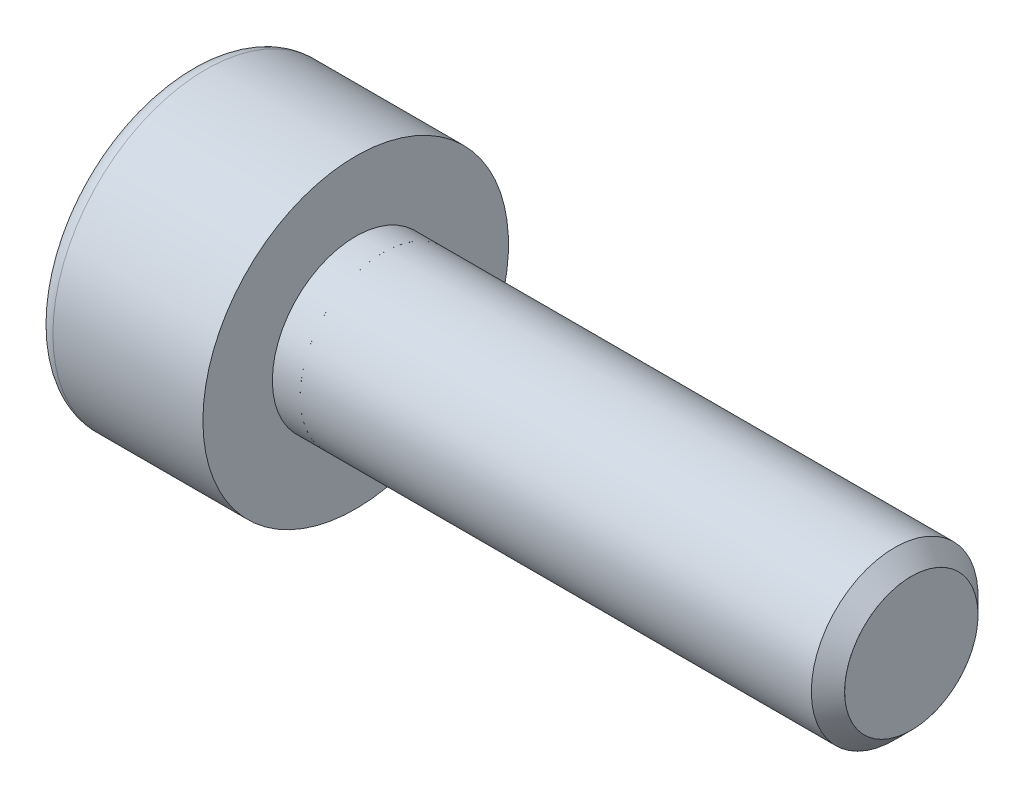
ISO-10303-21;
HEADER;
FILE_DESCRIPTION(('STEP AP214'),'2;1');
FILE_NAME('part.step','',(''),(''),'','','');
FILE_SCHEMA(('AUTOMOTIVE_DESIGN { 1 0 10303 214 1 1 1 1 }'));
ENDSEC;
DATA;
#1=APPLICATION_CONTEXT('core data for automotive mechanical design processes');
#2=APPLICATION_PROTOCOL_DEFINITION('international standard','automotive_design',2000,#1);
#3=PRODUCT_CONTEXT('',#1,'mechanical');
#4=PRODUCT('Part','Part','',(#3));
#5=PRODUCT_RELATED_PRODUCT_CATEGORY('part','',(#4));
#6=PRODUCT_DEFINITION_FORMATION('','',#4);
#7=PRODUCT_DEFINITION_CONTEXT('part definition',#1,'design');
#8=PRODUCT_DEFINITION('design','',#6,#7);
#9=PRODUCT_DEFINITION_SHAPE('','',#8);
#10=(LENGTH_UNIT() NAMED_UNIT(*) SI_UNIT(.MILLI.,.METRE.));
#11=(NAMED_UNIT(*) PLANE_ANGLE_UNIT() SI_UNIT($,.RADIAN.));
#12=(NAMED_UNIT(*) SI_UNIT($,.STERADIAN.) SOLID_ANGLE_UNIT());
#13=UNCERTAINTY_MEASURE_WITH_UNIT(LENGTH_MEASURE(1.E-05),#10,'distance_accuracy_value','');
#14=(GEOMETRIC_REPRESENTATION_CONTEXT(3) GLOBAL_UNCERTAINTY_ASSIGNED_CONTEXT((#13)) GLOBAL_UNIT_ASSIGNED_CONTEXT((#10,
#11,#12)) REPRESENTATION_CONTEXT('',''));
#15=CARTESIAN_POINT('',(0.,0.,0.));
#16=DIRECTION('',(0.,0.,1.));
#17=DIRECTION('',(1.,0.,0.));
#18=AXIS2_PLACEMENT_3D('',#15,#16,#17);
#19=CARTESIAN_POINT('',(1.5,0.,0.));
#20=DIRECTION('',(-1.,0.,0.));
#21=DIRECTION('',(0.,0.,1.));
#22=AXIS2_PLACEMENT_3D('',#19,#20,#21);
#23=PLANE('',#22);
#24=DIRECTION('',(0.,0.866025403784429,0.500000000000017));
#25=VECTOR('',#24,1.);
#26=CARTESIAN_POINT('',(1.5,1.25,-0.721687836487));
#27=LINE('',#26,#25);
#28=CARTESIAN_POINT('',(1.5,1.25,-0.721687836487001));
#29=VERTEX_POINT('',#28);
#30=CARTESIAN_POINT('',(1.5,0.,-1.44337567297402));
#31=VERTEX_POINT('',#30);
#32=EDGE_CURVE('P0_E129',#29,#31,#27,.F.);
#33=ORIENTED_EDGE('',*,*,#32,.T.);
#34=DIRECTION('',(0.,0.866025403784429,-0.500000000000017));
#35=VECTOR('',#34,1.);
#36=CARTESIAN_POINT('',(1.5,0.,-1.443375672974));
#37=LINE('',#36,#35);
#38=CARTESIAN_POINT('',(1.5,-1.24999999999999,-0.721687836486979));
#39=VERTEX_POINT('',#38);
#40=EDGE_CURVE('P0_E133',#31,#39,#37,.F.);
#41=ORIENTED_EDGE('',*,*,#40,.T.);
#42=DIRECTION('',(0.,0.,-1.));
#43=VECTOR('',#42,1.);
#44=CARTESIAN_POINT('',(1.5,-1.25,-0.721687836487));
#45=LINE('',#44,#43);
#46=CARTESIAN_POINT('',(1.5,-1.25,0.721687836487001));
#47=VERTEX_POINT('',#46);
#48=EDGE_CURVE('P0_E85',#39,#47,#45,.F.);
#49=ORIENTED_EDGE('',*,*,#48,.T.);
#50=DIRECTION('',(0.,-0.866025403784429,-0.500000000000017));
#51=VECTOR('',#50,1.);
#52=CARTESIAN_POINT('',(1.5,-1.25,0.721687836487));
#53=LINE('',#52,#51);
#54=CARTESIAN_POINT('',(1.5,0.,1.44337567297402));
#55=VERTEX_POINT('',#54);
#56=EDGE_CURVE('P0_E68',#47,#55,#53,.F.);
#57=ORIENTED_EDGE('',*,*,#56,.T.);
#58=DIRECTION('',(0.,-0.866025403784429,0.500000000000017));
#59=VECTOR('',#58,1.);
#60=CARTESIAN_POINT('',(1.5,0.,1.443375672974));
#61=LINE('',#60,#59);
#62=CARTESIAN_POINT('',(1.5,1.24999999999998,0.72168783648697));
#63=VERTEX_POINT('',#62);
#64=EDGE_CURVE('P0_E73',#55,#63,#61,.F.);
#65=ORIENTED_EDGE('',*,*,#64,.T.);
#66=DIRECTION('',(0.,0.,1.));
#67=VECTOR('',#66,1.);
#68=CARTESIAN_POINT('',(1.5,1.25,0.721687836487));
#69=LINE('',#68,#67);
#70=EDGE_CURVE('P0_E125',#63,#29,#69,.F.);
#71=ORIENTED_EDGE('',*,*,#70,.T.);
#72=EDGE_LOOP('',(#33,#41,#49,#57,#65,#71));
#73=FACE_BOUND('',#72,.T.);
#74=ADVANCED_FACE('P0_F17',(#73),#23,.T.);
#75=CARTESIAN_POINT('',(1.5,0.,1.443375672974));
#76=DIRECTION('',(0.,0.500000000000017,0.866025403784429));
#77=DIRECTION('',(0.,-0.866025403784429,0.500000000000017));
#78=AXIS2_PLACEMENT_3D('',#75,#76,#77);
#79=PLANE('',#78);
#80=DIRECTION('',(1.,0.,0.));
#81=VECTOR('',#80,1.);
#82=CARTESIAN_POINT('',(1.5,0.,1.44337567297405));
#83=LINE('',#82,#81);
#84=CARTESIAN_POINT('',(0.,0.,1.44337567297402));
#85=VERTEX_POINT('',#84);
#86=EDGE_CURVE('P0_E75',#55,#85,#83,.F.);
#87=ORIENTED_EDGE('',*,*,#86,.T.);
#88=DIRECTION('',(0.,-0.866025403784441,0.499999999999996));
#89=VECTOR('',#88,1.);
#90=CARTESIAN_POINT('',(0.,1.24999999999999,0.721687836486988));
#91=LINE('',#90,#89);
#92=CARTESIAN_POINT('',(0.,1.24999999999999,0.721687836486969));
#93=VERTEX_POINT('',#92);
#94=EDGE_CURVE('P0_E123',#93,#85,#91,.T.);
#95=ORIENTED_EDGE('',*,*,#94,.F.);
#96=DIRECTION('',(1.,0.,0.));
#97=VECTOR('',#96,1.);
#98=CARTESIAN_POINT('',(1.5,1.25,0.721687836486988));
#99=LINE('',#98,#97);
#100=EDGE_CURVE('P0_E78',#93,#63,#99,.T.);
#101=ORIENTED_EDGE('',*,*,#100,.T.);
#102=ORIENTED_EDGE('',*,*,#64,.F.);
#103=EDGE_LOOP('',(#87,#95,#101,#102));
#104=FACE_BOUND('',#103,.T.);
#105=ADVANCED_FACE('P0_F74',(#104),#79,.F.);
#106=CARTESIAN_POINT('',(1.5,-1.25,0.721687836487));
#107=DIRECTION('',(0.,-0.500000000000017,0.866025403784429));
#108=DIRECTION('',(0.,-0.866025403784429,-0.500000000000017));
#109=AXIS2_PLACEMENT_3D('',#106,#107,#108);
#110=PLANE('',#109);
#111=DIRECTION('',(1.,0.,0.));
#112=VECTOR('',#111,1.);
#113=CARTESIAN_POINT('',(1.5,-1.25,0.721687836487));
#114=LINE('',#113,#112);
#115=CARTESIAN_POINT('',(0.,-1.25,0.721687836487));
#116=VERTEX_POINT('',#115);
#117=EDGE_CURVE('P0_E87',#47,#116,#114,.F.);
#118=ORIENTED_EDGE('',*,*,#117,.T.);
#119=DIRECTION('',(0.,-0.866025403784443,-0.499999999999992));
#120=VECTOR('',#119,1.);
#121=CARTESIAN_POINT('',(0.,0.,1.44337567297401));
#122=LINE('',#121,#120);
#123=EDGE_CURVE('P0_E91',#85,#116,#122,.T.);
#124=ORIENTED_EDGE('',*,*,#123,.F.);
#125=ORIENTED_EDGE('',*,*,#86,.F.);
#126=ORIENTED_EDGE('',*,*,#56,.F.);
#127=EDGE_LOOP('',(#118,#124,#125,#126));
#128=FACE_BOUND('',#127,.T.);
#129=ADVANCED_FACE('P0_F89',(#128),#110,.F.);
#130=CARTESIAN_POINT('',(1.5,-1.25,-0.721687836487));
#131=DIRECTION('',(0.,-1.,0.));
#132=DIRECTION('',(0.,0.,-1.));
#133=AXIS2_PLACEMENT_3D('',#130,#131,#132);
#134=PLANE('',#133);
#135=DIRECTION('',(1.,0.,0.));
#136=VECTOR('',#135,1.);
#137=CARTESIAN_POINT('',(1.5,-1.24999999999997,-0.721687836486952));
#138=LINE('',#137,#136);
#139=CARTESIAN_POINT('',(0.,-1.24999999999999,-0.721687836486978));
#140=VERTEX_POINT('',#139);
#141=EDGE_CURVE('P0_E135',#39,#140,#138,.F.);
#142=ORIENTED_EDGE('',*,*,#141,.T.);
#143=DIRECTION('',(0.,0.,1.));
#144=VECTOR('',#143,1.);
#145=CARTESIAN_POINT('',(0.,-1.25,0.));
#146=LINE('',#145,#144);
#147=EDGE_CURVE('P0_E119',#116,#140,#146,.F.);
#148=ORIENTED_EDGE('',*,*,#147,.F.);
#149=ORIENTED_EDGE('',*,*,#117,.F.);
#150=ORIENTED_EDGE('',*,*,#48,.F.);
#151=EDGE_LOOP('',(#142,#148,#149,#150));
#152=FACE_BOUND('',#151,.T.);
#153=ADVANCED_FACE('P0_F139',(#152),#134,.F.);
#154=CARTESIAN_POINT('',(1.5,0.,-1.443375672974));
#155=DIRECTION('',(0.,-0.500000000000017,-0.866025403784429));
#156=DIRECTION('',(0.,0.866025403784429,-0.500000000000017));
#157=AXIS2_PLACEMENT_3D('',#154,#155,#156);
#158=PLANE('',#157);
#159=DIRECTION('',(1.,0.,0.));
#160=VECTOR('',#159,1.);
#161=CARTESIAN_POINT('',(1.5,0.,-1.44337567297405));
#162=LINE('',#161,#160);
#163=CARTESIAN_POINT('',(0.,0.,-1.44337567297402));
#164=VERTEX_POINT('',#163);
#165=EDGE_CURVE('P0_E131',#31,#164,#162,.F.);
#166=ORIENTED_EDGE('',*,*,#165,.T.);
#167=DIRECTION('',(0.,0.866025403784441,-0.499999999999996));
#168=VECTOR('',#167,1.);
#169=CARTESIAN_POINT('',(0.,-1.24999999999999,-0.721687836486988));
#170=LINE('',#169,#168);
#171=EDGE_CURVE('P0_E116',#140,#164,#170,.T.);
#172=ORIENTED_EDGE('',*,*,#171,.F.);
#173=ORIENTED_EDGE('',*,*,#141,.F.);
#174=ORIENTED_EDGE('',*,*,#40,.F.);
#175=EDGE_LOOP('',(#166,#172,#173,#174));
#176=FACE_BOUND('',#175,.T.);
#177=ADVANCED_FACE('P0_F149',(#176),#158,.F.);
#178=CARTESIAN_POINT('',(1.5,1.25,-0.721687836487));
#179=DIRECTION('',(0.,0.500000000000017,-0.866025403784429));
#180=DIRECTION('',(0.,0.866025403784429,0.500000000000017));
#181=AXIS2_PLACEMENT_3D('',#178,#179,#180);
#182=PLANE('',#181);
#183=DIRECTION('',(1.,0.,0.));
#184=VECTOR('',#183,1.);
#185=CARTESIAN_POINT('',(1.5,1.25,-0.721687836487));
#186=LINE('',#185,#184);
#187=CARTESIAN_POINT('',(0.,1.25,-0.721687836487));
#188=VERTEX_POINT('',#187);
#189=EDGE_CURVE('P0_E36',#29,#188,#186,.F.);
#190=ORIENTED_EDGE('',*,*,#189,.T.);
#191=DIRECTION('',(0.,0.866025403784443,0.499999999999992));
#192=VECTOR('',#191,1.);
#193=CARTESIAN_POINT('',(0.,0.,-1.44337567297401));
#194=LINE('',#193,#192);
#195=EDGE_CURVE('P0_E113',#164,#188,#194,.T.);
#196=ORIENTED_EDGE('',*,*,#195,.F.);
#197=ORIENTED_EDGE('',*,*,#165,.F.);
#198=ORIENTED_EDGE('',*,*,#32,.F.);
#199=EDGE_LOOP('',(#190,#196,#197,#198));
#200=FACE_BOUND('',#199,.T.);
#201=ADVANCED_FACE('P0_F147',(#200),#182,.F.);
#202=CARTESIAN_POINT('',(1.5,1.25,0.721687836487));
#203=DIRECTION('',(0.,1.,0.));
#204=DIRECTION('',(0.,0.,1.));
#205=AXIS2_PLACEMENT_3D('',#202,#203,#204);
#206=PLANE('',#205);
#207=ORIENTED_EDGE('',*,*,#100,.F.);
#208=DIRECTION('',(0.,0.,1.));
#209=VECTOR('',#208,1.);
#210=CARTESIAN_POINT('',(0.,1.25,0.));
#211=LINE('',#210,#209);
#212=EDGE_CURVE('P0_E108',#188,#93,#211,.T.);
#213=ORIENTED_EDGE('',*,*,#212,.F.);
#214=ORIENTED_EDGE('',*,*,#189,.F.);
#215=ORIENTED_EDGE('',*,*,#70,.F.);
#216=EDGE_LOOP('',(#207,#213,#214,#215));
#217=FACE_BOUND('',#216,.T.);
#218=ADVANCED_FACE('P0_F145',(#217),#206,.F.);
#219=CARTESIAN_POINT('',(0.,0.,0.));
#220=DIRECTION('',(-1.,0.,0.));
#221=DIRECTION('',(0.,0.,1.));
#222=AXIS2_PLACEMENT_3D('',#219,#220,#221);
#223=PLANE('',#222);
#224=CARTESIAN_POINT('',(0.,0.,0.));
#225=DIRECTION('',(-1.,0.,0.));
#226=DIRECTION('',(0.,0.,1.));
#227=AXIS2_PLACEMENT_3D('',#224,#225,#226);
#228=CIRCLE('',#227,2.45);
#229=CARTESIAN_POINT('',(0.,0.,2.45));
#230=VERTEX_POINT('',#229);
#231=EDGE_CURVE('P0_E21',#230,#230,#228,.F.);
#232=ORIENTED_EDGE('',*,*,#231,.F.);
#233=EDGE_LOOP('',(#232));
#234=FACE_BOUND('',#233,.T.);
#235=ORIENTED_EDGE('',*,*,#195,.T.);
#236=ORIENTED_EDGE('',*,*,#212,.T.);
#237=ORIENTED_EDGE('',*,*,#94,.T.);
#238=ORIENTED_EDGE('',*,*,#123,.T.);
#239=ORIENTED_EDGE('',*,*,#147,.T.);
#240=ORIENTED_EDGE('',*,*,#171,.T.);
#241=EDGE_LOOP('',(#235,#236,#237,#238,#239,#240));
#242=FACE_BOUND('',#241,.T.);
#243=ADVANCED_FACE('P0_F143',(#234,#242),#223,.T.);
#244=CARTESIAN_POINT('',(0.300000000000001,0.,0.));
#245=DIRECTION('',(-1.,0.,0.));
#246=DIRECTION('',(0.,0.,1.));
#247=AXIS2_PLACEMENT_3D('',#244,#245,#246);
#248=TOROIDAL_SURFACE('',#247,2.45,0.300000000000001);
#249=CARTESIAN_POINT('',(0.3,0.,0.));
#250=DIRECTION('',(-1.,0.,0.));
#251=DIRECTION('',(0.,0.,1.));
#252=AXIS2_PLACEMENT_3D('',#249,#250,#251);
#253=CIRCLE('',#252,2.75);
#254=CARTESIAN_POINT('',(0.3,0.,2.75));
#255=VERTEX_POINT('',#254);
#256=EDGE_CURVE('P0_E100',#255,#255,#253,.F.);
#257=ORIENTED_EDGE('',*,*,#256,.F.);
#258=EDGE_LOOP('',(#257));
#259=FACE_BOUND('',#258,.T.);
#260=ORIENTED_EDGE('',*,*,#231,.T.);
#261=EDGE_LOOP('',(#260));
#262=FACE_BOUND('',#261,.T.);
#263=ADVANCED_FACE('P0_F19',(#259,#262),#248,.T.);
#264=CARTESIAN_POINT('',(13.,0.,0.));
#265=DIRECTION('',(-1.,0.,0.));
#266=DIRECTION('',(0.,0.,1.));
#267=AXIS2_PLACEMENT_3D('',#264,#265,#266);
#268=PLANE('',#267);
#269=CARTESIAN_POINT('',(13.0000000000905,0.,0.));
#270=DIRECTION('',(-1.,0.,0.));
#271=DIRECTION('',(0.,0.,1.));
#272=AXIS2_PLACEMENT_3D('',#269,#270,#271);
#273=CIRCLE('',#272,1.19999999998299);
#274=CARTESIAN_POINT('',(13.0000000000905,0.,1.19999999998299));
#275=VERTEX_POINT('',#274);
#276=EDGE_CURVE('P0_E98',#275,#275,#273,.T.);
#277=ORIENTED_EDGE('',*,*,#276,.F.);
#278=EDGE_LOOP('',(#277));
#279=FACE_BOUND('',#278,.T.);
#280=ADVANCED_FACE('P0_F178',(#279),#268,.F.);
#281=CARTESIAN_POINT('',(13.65,0.,0.));
#282=DIRECTION('',(-1.,0.,0.));
#283=DIRECTION('',(0.,0.,1.));
#284=AXIS2_PLACEMENT_3D('',#281,#282,#283);
#285=CYLINDRICAL_SURFACE('',#284,2.75);
#286=ORIENTED_EDGE('',*,*,#256,.T.);
#287=EDGE_LOOP('',(#286));
#288=FACE_BOUND('',#287,.T.);
#289=CARTESIAN_POINT('',(3.,0.,0.));
#290=DIRECTION('',(-1.,0.,0.));
#291=DIRECTION('',(0.,0.,1.));
#292=AXIS2_PLACEMENT_3D('',#289,#290,#291);
#293=CIRCLE('',#292,2.75);
#294=CARTESIAN_POINT('',(3.,0.,2.75));
#295=VERTEX_POINT('',#294);
#296=EDGE_CURVE('P0_E96',#295,#295,#293,.T.);
#297=ORIENTED_EDGE('',*,*,#296,.T.);
#298=EDGE_LOOP('',(#297));
#299=FACE_BOUND('',#298,.T.);
#300=ADVANCED_FACE('P0_F174',(#288,#299),#285,.T.);
#301=CARTESIAN_POINT('',(12.7000000000521,0.,0.));
#302=DIRECTION('',(-1.,0.,0.));
#303=DIRECTION('',(0.,0.,1.));
#304=AXIS2_PLACEMENT_3D('',#301,#302,#303);
#305=CONICAL_SURFACE('',#304,1.50000000002137,0.785398163397448);
#306=CARTESIAN_POINT('',(12.7,0.,0.));
#307=DIRECTION('',(-1.,0.,0.));
#308=DIRECTION('',(0.,0.,1.));
#309=AXIS2_PLACEMENT_3D('',#306,#307,#308);
#310=CIRCLE('',#309,1.5);
#311=CARTESIAN_POINT('',(12.7,0.,1.5));
#312=VERTEX_POINT('',#311);
#313=EDGE_CURVE('P0_E27',#312,#312,#310,.T.);
#314=ORIENTED_EDGE('',*,*,#313,.F.);
#315=EDGE_LOOP('',(#314));
#316=FACE_BOUND('',#315,.T.);
#317=ORIENTED_EDGE('',*,*,#276,.T.);
#318=EDGE_LOOP('',(#317));
#319=FACE_BOUND('',#318,.T.);
#320=ADVANCED_FACE('P0_F167',(#316,#319),#305,.T.);
#321=CARTESIAN_POINT('',(3.,0.,0.));
#322=DIRECTION('',(-1.,0.,0.));
#323=DIRECTION('',(0.,0.,1.));
#324=AXIS2_PLACEMENT_3D('',#321,#322,#323);
#325=PLANE('',#324);
#326=ORIENTED_EDGE('',*,*,#296,.F.);
#327=EDGE_LOOP('',(#326));
#328=FACE_BOUND('',#327,.T.);
#329=CARTESIAN_POINT('',(3.,0.,0.));
#330=DIRECTION('',(-1.,0.,0.));
#331=DIRECTION('',(0.,0.,1.));
#332=AXIS2_PLACEMENT_3D('',#329,#330,#331);
#333=CIRCLE('',#332,1.5);
#334=CARTESIAN_POINT('',(3.,0.,1.5));
#335=VERTEX_POINT('',#334);
#336=EDGE_CURVE('P0_E11',#335,#335,#333,.F.);
#337=ORIENTED_EDGE('',*,*,#336,.F.);
#338=EDGE_LOOP('',(#337));
#339=FACE_BOUND('',#338,.T.);
#340=ADVANCED_FACE('P0_F161',(#328,#339),#325,.F.);
#341=CARTESIAN_POINT('',(13.65,0.,0.));
#342=DIRECTION('',(-1.,0.,0.));
#343=DIRECTION('',(0.,0.,1.));
#344=AXIS2_PLACEMENT_3D('',#341,#342,#343);
#345=CYLINDRICAL_SURFACE('',#344,1.5);
#346=ORIENTED_EDGE('',*,*,#336,.T.);
#347=EDGE_LOOP('',(#346));
#348=FACE_BOUND('',#347,.T.);
#349=ORIENTED_EDGE('',*,*,#313,.T.);
#350=EDGE_LOOP('',(#349));
#351=FACE_BOUND('',#350,.T.);
#352=ADVANCED_FACE('P0_F159',(#348,#351),#345,.T.);
#353=CLOSED_SHELL('',(#74,#105,#129,#153,#177,#201,#218,#243,#263,#280,#300,#320,#340,#352));
#354=MANIFOLD_SOLID_BREP('P0_B1',#353);
#355=CARTESIAN_POINT('',(13.,0.,0.));
#356=DIRECTION('',(1.,0.,0.));
#357=DIRECTION('',(0.,0.,-1.));
#358=AXIS2_PLACEMENT_3D('',#355,#356,#357);
#359=CYLINDRICAL_SURFACE('',#358,1.2);
#360=CARTESIAN_POINT('',(13.,0.,0.));
#361=DIRECTION('',(1.,0.,0.));
#362=DIRECTION('',(0.,0.,-1.));
#363=AXIS2_PLACEMENT_3D('',#360,#361,#362);
#364=CIRCLE('',#363,1.2);
#365=CARTESIAN_POINT('',(13.,0.,-1.2));
#366=VERTEX_POINT('',#365);
#367=EDGE_CURVE('P1_E11',#366,#366,#364,.F.);
#368=ORIENTED_EDGE('',*,*,#367,.T.);
#369=EDGE_LOOP('',(#368));
#370=FACE_BOUND('',#369,.T.);
#371=CARTESIAN_POINT('',(3.5,0.,0.));
#372=DIRECTION('',(1.,0.,0.));
#373=DIRECTION('',(0.,0.,-1.));
#374=AXIS2_PLACEMENT_3D('',#371,#372,#373);
#375=CIRCLE('',#374,1.2);
#376=CARTESIAN_POINT('',(3.5,0.,-1.2));
#377=VERTEX_POINT('',#376);
#378=EDGE_CURVE('P1_E21',#377,#377,#375,.T.);
#379=ORIENTED_EDGE('',*,*,#378,.T.);
#380=EDGE_LOOP('',(#379));
#381=FACE_BOUND('',#380,.T.);
#382=ADVANCED_FACE('P1_F17',(#370,#381),#359,.T.);
#383=CARTESIAN_POINT('',(3.5,0.,0.));
#384=DIRECTION('',(1.,0.,0.));
#385=DIRECTION('',(0.,0.,-1.));
#386=AXIS2_PLACEMENT_3D('',#383,#384,#385);
#387=PLANE('',#386);
#388=CARTESIAN_POINT('',(3.5,-1.5,0.));
#389=CARTESIAN_POINT('',(3.5,-1.49923604234444,-0.299484631998123));
#390=CARTESIAN_POINT('',(3.5,-1.38581929876717,-0.574025148547617));
#391=CARTESIAN_POINT('',(3.5,-1.27237937655433,-0.848621772109));
#392=CARTESIAN_POINT('',(3.5,-1.06066017177977,-1.06066017177958));
#393=CARTESIAN_POINT('',(3.5,-0.8506194867072,-1.27101752115618));
#394=CARTESIAN_POINT('',(3.5,-0.57402514854765,-1.385819298767));
#395=CARTESIAN_POINT('',(3.5,-0.29944205881112,-1.49978629828469));
#396=CARTESIAN_POINT('',(3.5,0.,-1.5));
#397=CARTESIAN_POINT('',(3.5,0.297301073279322,-1.50021217376603));
#398=CARTESIAN_POINT('',(3.5,0.57402514854765,-1.385819298767));
#399=CARTESIAN_POINT('',(3.5,0.848804448872379,-1.27223035959036));
#400=CARTESIAN_POINT('',(3.5,1.06066017177977,-1.06066017177958));
#401=CARTESIAN_POINT('',(3.5,1.27116518598941,-0.850438872207169));
#402=CARTESIAN_POINT('',(3.5,1.38581929876717,-0.574025148547617));
#403=CARTESIAN_POINT('',(3.5,1.49923319356508,-0.300601402845709));
#404=CARTESIAN_POINT('',(3.5,1.5,0.));
#405=B_SPLINE_CURVE_WITH_KNOTS('',2,(#388,#389,#390,#391,#392,#393,#394,#395,#396,#397,#398,
#399,#400,#401,#402,#403,#404),.UNSPECIFIED.,.F.,.F.,(3,2,2,2,2,2,2,2,3),(0.,0.125,0.25,0.375,
0.5,0.625,0.75,0.875,1.),.UNSPECIFIED.);
#406=CARTESIAN_POINT('',(3.5,-1.5,0.));
#407=VERTEX_POINT('',#406);
#408=CARTESIAN_POINT('',(3.5,1.5,0.));
#409=VERTEX_POINT('',#408);
#410=EDGE_CURVE('P1_E32',#407,#409,#405,.T.);
#411=ORIENTED_EDGE('',*,*,#410,.T.);
#412=CARTESIAN_POINT('',(3.5,1.5,0.));
#413=CARTESIAN_POINT('',(3.5,1.49923604234444,0.299484631998123));
#414=CARTESIAN_POINT('',(3.5,1.38581929876717,0.574025148547617));
#415=CARTESIAN_POINT('',(3.5,1.27237937655433,0.848621772109));
#416=CARTESIAN_POINT('',(3.5,1.06066017177977,1.06066017177958));
#417=CARTESIAN_POINT('',(3.5,0.8506194867072,1.27101752115618));
#418=CARTESIAN_POINT('',(3.5,0.57402514854765,1.385819298767));
#419=CARTESIAN_POINT('',(3.5,0.29944205881112,1.49978629828469));
#420=CARTESIAN_POINT('',(3.5,0.,1.5));
#421=CARTESIAN_POINT('',(3.5,-0.297301073279322,1.50021217376603));
#422=CARTESIAN_POINT('',(3.5,-0.57402514854765,1.385819298767));
#423=CARTESIAN_POINT('',(3.5,-0.848804448872379,1.27223035959036));
#424=CARTESIAN_POINT('',(3.5,-1.06066017177977,1.06066017177958));
#425=CARTESIAN_POINT('',(3.5,-1.27116518598941,0.850438872207169));
#426=CARTESIAN_POINT('',(3.5,-1.38581929876717,0.574025148547617));
#427=CARTESIAN_POINT('',(3.5,-1.49923319356508,0.300601402845709));
#428=CARTESIAN_POINT('',(3.5,-1.5,0.));
#429=B_SPLINE_CURVE_WITH_KNOTS('',2,(#412,#413,#414,#415,#416,#417,#418,#419,#420,#421,#422,
#423,#424,#425,#426,#427,#428),.UNSPECIFIED.,.F.,.F.,(3,2,2,2,2,2,2,2,3),(0.,0.125,0.25,0.375,
0.5,0.625,0.75,0.875,1.),.UNSPECIFIED.);
#430=EDGE_CURVE('P1_E35',#409,#407,#429,.T.);
#431=ORIENTED_EDGE('',*,*,#430,.T.);
#432=EDGE_LOOP('',(#411,#431));
#433=FACE_BOUND('',#432,.T.);
#434=ORIENTED_EDGE('',*,*,#378,.F.);
#435=EDGE_LOOP('',(#434));
#436=FACE_BOUND('',#435,.T.);
#437=ADVANCED_FACE('P1_F18',(#433,#436),#387,.T.);
#438=OPEN_SHELL('',(#382,#437));
#439=SHELL_BASED_SURFACE_MODEL('P1_B1',(#438));
#440=ADVANCED_BREP_SHAPE_REPRESENTATION('',(#18,#354),#14);
#441=MANIFOLD_SURFACE_SHAPE_REPRESENTATION('',(#18,#439),#14);
#442=SHAPE_REPRESENTATION('',(#18),#14);
#443=SHAPE_DEFINITION_REPRESENTATION(#9,#442);
#444=SHAPE_REPRESENTATION_RELATIONSHIP('','',#442,#440);
#445=SHAPE_REPRESENTATION_RELATIONSHIP('','',#442,#441);
ENDSEC;
END-ISO-10303-21;
